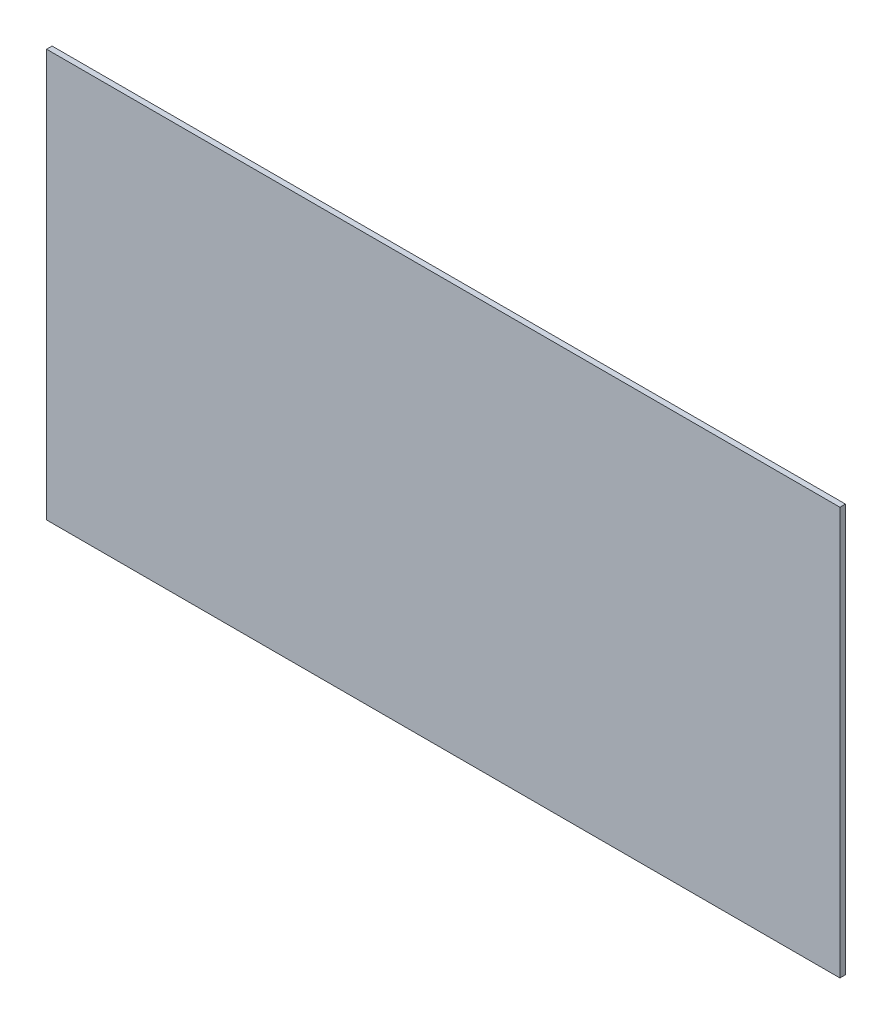
ISO-10303-21;
HEADER;
FILE_DESCRIPTION(('STEP AP214'),'2;1');
FILE_NAME('part.step','',(''),(''),'','','');
FILE_SCHEMA(('AUTOMOTIVE_DESIGN { 1 0 10303 214 1 1 1 1 }'));
ENDSEC;
DATA;
#1=APPLICATION_CONTEXT('core data for automotive mechanical design processes');
#2=APPLICATION_PROTOCOL_DEFINITION('international standard','automotive_design',2000,#1);
#3=PRODUCT_CONTEXT('',#1,'mechanical');
#4=PRODUCT('Part','Part','',(#3));
#5=PRODUCT_RELATED_PRODUCT_CATEGORY('part','',(#4));
#6=PRODUCT_DEFINITION_FORMATION('','',#4);
#7=PRODUCT_DEFINITION_CONTEXT('part definition',#1,'design');
#8=PRODUCT_DEFINITION('design','',#6,#7);
#9=PRODUCT_DEFINITION_SHAPE('','',#8);
#10=(LENGTH_UNIT() NAMED_UNIT(*) SI_UNIT(.MILLI.,.METRE.));
#11=(NAMED_UNIT(*) PLANE_ANGLE_UNIT() SI_UNIT($,.RADIAN.));
#12=(NAMED_UNIT(*) SI_UNIT($,.STERADIAN.) SOLID_ANGLE_UNIT());
#13=UNCERTAINTY_MEASURE_WITH_UNIT(LENGTH_MEASURE(1.E-05),#10,'distance_accuracy_value','');
#14=(GEOMETRIC_REPRESENTATION_CONTEXT(3) GLOBAL_UNCERTAINTY_ASSIGNED_CONTEXT((#13)) GLOBAL_UNIT_ASSIGNED_CONTEXT((#10,
#11,#12)) REPRESENTATION_CONTEXT('',''));
#15=CARTESIAN_POINT('',(0.,0.,0.));
#16=DIRECTION('',(0.,0.,1.));
#17=DIRECTION('',(1.,0.,0.));
#18=AXIS2_PLACEMENT_3D('',#15,#16,#17);
#19=CARTESIAN_POINT('',(-914.4,-469.9,6.35));
#20=DIRECTION('',(-1.,0.,0.));
#21=DIRECTION('',(0.,0.,1.));
#22=AXIS2_PLACEMENT_3D('',#19,#20,#21);
#23=PLANE('',#22);
#24=DIRECTION('',(0.,1.,0.));
#25=VECTOR('',#24,1.);
#26=CARTESIAN_POINT('',(-914.4,-469.9,-6.35));
#27=LINE('',#26,#25);
#28=CARTESIAN_POINT('',(-914.4,-469.9,-6.35));
#29=VERTEX_POINT('',#28);
#30=CARTESIAN_POINT('',(-914.4,469.9,-6.35));
#31=VERTEX_POINT('',#30);
#32=EDGE_CURVE('E114',#29,#31,#27,.T.);
#33=ORIENTED_EDGE('',*,*,#32,.F.);
#34=DIRECTION('',(0.,0.,-1.));
#35=VECTOR('',#34,1.);
#36=CARTESIAN_POINT('',(-914.4,-469.9,6.35));
#37=LINE('',#36,#35);
#38=CARTESIAN_POINT('',(-914.4,-469.9,6.35));
#39=VERTEX_POINT('',#38);
#40=EDGE_CURVE('E11',#39,#29,#37,.T.);
#41=ORIENTED_EDGE('',*,*,#40,.F.);
#42=DIRECTION('',(0.,1.,0.));
#43=VECTOR('',#42,1.);
#44=CARTESIAN_POINT('',(-914.4,-469.9,6.35));
#45=LINE('',#44,#43);
#46=CARTESIAN_POINT('',(-914.4,469.9,6.35));
#47=VERTEX_POINT('',#46);
#48=EDGE_CURVE('E107',#39,#47,#45,.T.);
#49=ORIENTED_EDGE('',*,*,#48,.T.);
#50=DIRECTION('',(0.,0.,-1.));
#51=VECTOR('',#50,1.);
#52=CARTESIAN_POINT('',(-914.4,469.9,6.35));
#53=LINE('',#52,#51);
#54=EDGE_CURVE('E46',#47,#31,#53,.T.);
#55=ORIENTED_EDGE('',*,*,#54,.T.);
#56=EDGE_LOOP('',(#33,#41,#49,#55));
#57=FACE_BOUND('',#56,.T.);
#58=ADVANCED_FACE('F43',(#57),#23,.T.);
#59=CARTESIAN_POINT('',(-914.4,-469.9,6.35));
#60=DIRECTION('',(0.,1.,0.));
#61=DIRECTION('',(0.,0.,1.));
#62=AXIS2_PLACEMENT_3D('',#59,#60,#61);
#63=PLANE('',#62);
#64=DIRECTION('',(1.,0.,0.));
#65=VECTOR('',#64,1.);
#66=CARTESIAN_POINT('',(-914.4,-469.9,-6.35));
#67=LINE('',#66,#65);
#68=CARTESIAN_POINT('',(914.4,-469.9,-6.35));
#69=VERTEX_POINT('',#68);
#70=EDGE_CURVE('E77',#29,#69,#67,.T.);
#71=ORIENTED_EDGE('',*,*,#70,.T.);
#72=DIRECTION('',(0.,0.,-1.));
#73=VECTOR('',#72,1.);
#74=CARTESIAN_POINT('',(914.4,-469.9,6.35));
#75=LINE('',#74,#73);
#76=CARTESIAN_POINT('',(914.4,-469.9,6.35));
#77=VERTEX_POINT('',#76);
#78=EDGE_CURVE('E53',#77,#69,#75,.T.);
#79=ORIENTED_EDGE('',*,*,#78,.F.);
#80=DIRECTION('',(1.,0.,0.));
#81=VECTOR('',#80,1.);
#82=CARTESIAN_POINT('',(-914.4,-469.9,6.35));
#83=LINE('',#82,#81);
#84=EDGE_CURVE('E94',#39,#77,#83,.T.);
#85=ORIENTED_EDGE('',*,*,#84,.F.);
#86=ORIENTED_EDGE('',*,*,#40,.T.);
#87=EDGE_LOOP('',(#71,#79,#85,#86));
#88=FACE_BOUND('',#87,.T.);
#89=ADVANCED_FACE('F130',(#88),#63,.F.);
#90=CARTESIAN_POINT('',(914.4,-469.9,6.35));
#91=DIRECTION('',(-1.,0.,0.));
#92=DIRECTION('',(0.,0.,1.));
#93=AXIS2_PLACEMENT_3D('',#90,#91,#92);
#94=PLANE('',#93);
#95=DIRECTION('',(0.,1.,0.));
#96=VECTOR('',#95,1.);
#97=CARTESIAN_POINT('',(914.4,-469.9,-6.35));
#98=LINE('',#97,#96);
#99=CARTESIAN_POINT('',(914.4,469.9,-6.35));
#100=VERTEX_POINT('',#99);
#101=EDGE_CURVE('E102',#69,#100,#98,.T.);
#102=ORIENTED_EDGE('',*,*,#101,.T.);
#103=DIRECTION('',(0.,0.,-1.));
#104=VECTOR('',#103,1.);
#105=CARTESIAN_POINT('',(914.4,469.9,6.35));
#106=LINE('',#105,#104);
#107=CARTESIAN_POINT('',(914.4,469.9,6.35));
#108=VERTEX_POINT('',#107);
#109=EDGE_CURVE('E99',#108,#100,#106,.T.);
#110=ORIENTED_EDGE('',*,*,#109,.F.);
#111=DIRECTION('',(0.,1.,0.));
#112=VECTOR('',#111,1.);
#113=CARTESIAN_POINT('',(914.4,-469.9,6.35));
#114=LINE('',#113,#112);
#115=EDGE_CURVE('E89',#77,#108,#114,.T.);
#116=ORIENTED_EDGE('',*,*,#115,.F.);
#117=ORIENTED_EDGE('',*,*,#78,.T.);
#118=EDGE_LOOP('',(#102,#110,#116,#117));
#119=FACE_BOUND('',#118,.T.);
#120=ADVANCED_FACE('F100',(#119),#94,.F.);
#121=CARTESIAN_POINT('',(-914.4,469.9,6.35));
#122=DIRECTION('',(0.,1.,0.));
#123=DIRECTION('',(0.,0.,1.));
#124=AXIS2_PLACEMENT_3D('',#121,#122,#123);
#125=PLANE('',#124);
#126=DIRECTION('',(1.,0.,0.));
#127=VECTOR('',#126,1.);
#128=CARTESIAN_POINT('',(-914.4,469.9,-6.35));
#129=LINE('',#128,#127);
#130=EDGE_CURVE('E118',#31,#100,#129,.T.);
#131=ORIENTED_EDGE('',*,*,#130,.F.);
#132=ORIENTED_EDGE('',*,*,#54,.F.);
#133=DIRECTION('',(1.,0.,0.));
#134=VECTOR('',#133,1.);
#135=CARTESIAN_POINT('',(-914.4,469.9,6.35));
#136=LINE('',#135,#134);
#137=EDGE_CURVE('E93',#47,#108,#136,.T.);
#138=ORIENTED_EDGE('',*,*,#137,.T.);
#139=ORIENTED_EDGE('',*,*,#109,.T.);
#140=EDGE_LOOP('',(#131,#132,#138,#139));
#141=FACE_BOUND('',#140,.T.);
#142=ADVANCED_FACE('F105',(#141),#125,.T.);
#143=CARTESIAN_POINT('',(0.,0.,6.35));
#144=DIRECTION('',(0.,0.,-1.));
#145=DIRECTION('',(-1.,0.,0.));
#146=AXIS2_PLACEMENT_3D('',#143,#144,#145);
#147=PLANE('',#146);
#148=ORIENTED_EDGE('',*,*,#48,.F.);
#149=ORIENTED_EDGE('',*,*,#84,.T.);
#150=ORIENTED_EDGE('',*,*,#115,.T.);
#151=ORIENTED_EDGE('',*,*,#137,.F.);
#152=EDGE_LOOP('',(#148,#149,#150,#151));
#153=FACE_BOUND('',#152,.T.);
#154=ADVANCED_FACE('F92',(#153),#147,.F.);
#155=CARTESIAN_POINT('',(0.,0.,-6.35));
#156=DIRECTION('',(0.,0.,-1.));
#157=DIRECTION('',(-1.,0.,0.));
#158=AXIS2_PLACEMENT_3D('',#155,#156,#157);
#159=PLANE('',#158);
#160=ORIENTED_EDGE('',*,*,#32,.T.);
#161=ORIENTED_EDGE('',*,*,#130,.T.);
#162=ORIENTED_EDGE('',*,*,#101,.F.);
#163=ORIENTED_EDGE('',*,*,#70,.F.);
#164=EDGE_LOOP('',(#160,#161,#162,#163));
#165=FACE_BOUND('',#164,.T.);
#166=ADVANCED_FACE('F127',(#165),#159,.T.);
#167=CLOSED_SHELL('',(#58,#89,#120,#142,#154,#166));
#168=MANIFOLD_SOLID_BREP('B2',#167);
#169=ADVANCED_BREP_SHAPE_REPRESENTATION('',(#18,#168),#14);
#170=SHAPE_DEFINITION_REPRESENTATION(#9,#169);
ENDSEC;
END-ISO-10303-21;
